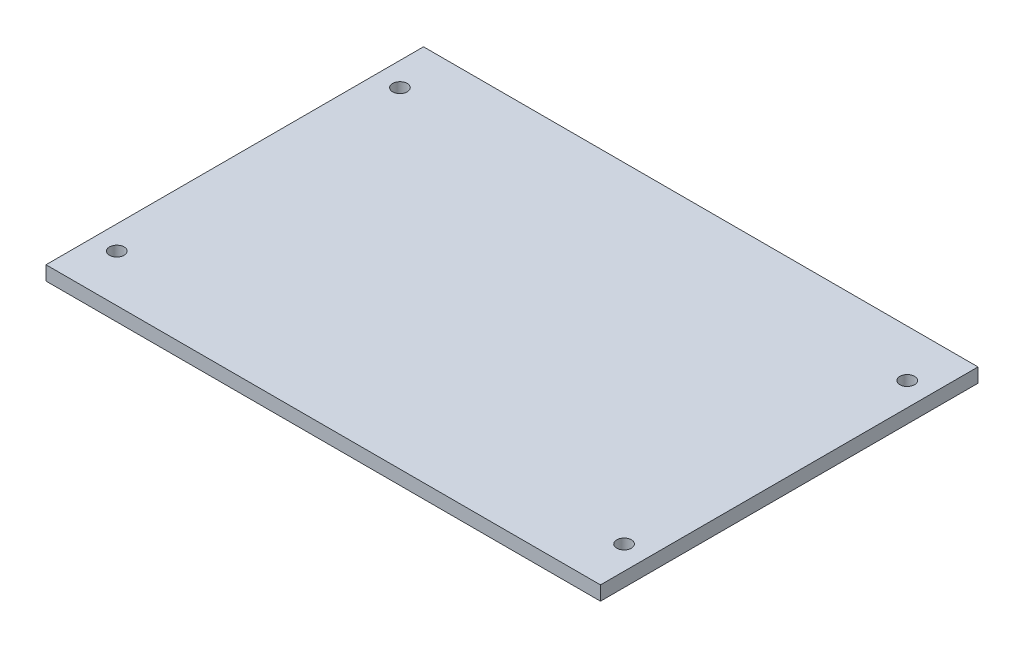
ISO-10303-21;
HEADER;
FILE_DESCRIPTION(('STEP AP214'),'2;1');
FILE_NAME('part.step','',(''),(''),'','','');
FILE_SCHEMA(('AUTOMOTIVE_DESIGN { 1 0 10303 214 1 1 1 1 }'));
ENDSEC;
DATA;
#1=APPLICATION_CONTEXT('core data for automotive mechanical design processes');
#2=APPLICATION_PROTOCOL_DEFINITION('international standard','automotive_design',2000,#1);
#3=PRODUCT_CONTEXT('',#1,'mechanical');
#4=PRODUCT('Part','Part','',(#3));
#5=PRODUCT_RELATED_PRODUCT_CATEGORY('part','',(#4));
#6=PRODUCT_DEFINITION_FORMATION('','',#4);
#7=PRODUCT_DEFINITION_CONTEXT('part definition',#1,'design');
#8=PRODUCT_DEFINITION('design','',#6,#7);
#9=PRODUCT_DEFINITION_SHAPE('','',#8);
#10=(LENGTH_UNIT() NAMED_UNIT(*) SI_UNIT(.MILLI.,.METRE.));
#11=(NAMED_UNIT(*) PLANE_ANGLE_UNIT() SI_UNIT($,.RADIAN.));
#12=(NAMED_UNIT(*) SI_UNIT($,.STERADIAN.) SOLID_ANGLE_UNIT());
#13=UNCERTAINTY_MEASURE_WITH_UNIT(LENGTH_MEASURE(1.E-05),#10,'distance_accuracy_value','');
#14=(GEOMETRIC_REPRESENTATION_CONTEXT(3) GLOBAL_UNCERTAINTY_ASSIGNED_CONTEXT((#13)) GLOBAL_UNIT_ASSIGNED_CONTEXT((#10,
#11,#12)) REPRESENTATION_CONTEXT('',''));
#15=CARTESIAN_POINT('',(0.,0.,0.));
#16=DIRECTION('',(0.,0.,1.));
#17=DIRECTION('',(1.,0.,0.));
#18=AXIS2_PLACEMENT_3D('',#15,#16,#17);
#19=CARTESIAN_POINT('',(0.,0.,80.));
#20=DIRECTION('',(1.,0.,0.));
#21=DIRECTION('',(0.,0.,-1.));
#22=AXIS2_PLACEMENT_3D('',#19,#20,#21);
#23=PLANE('',#22);
#24=DIRECTION('',(0.,-1.,0.));
#25=VECTOR('',#24,1.);
#26=CARTESIAN_POINT('',(0.,0.,0.));
#27=LINE('',#26,#25);
#28=CARTESIAN_POINT('',(0.,3.,0.));
#29=VERTEX_POINT('',#28);
#30=CARTESIAN_POINT('',(0.,0.,0.));
#31=VERTEX_POINT('',#30);
#32=EDGE_CURVE('E117',#29,#31,#27,.T.);
#33=ORIENTED_EDGE('',*,*,#32,.T.);
#34=DIRECTION('',(0.,0.,-1.));
#35=VECTOR('',#34,1.);
#36=CARTESIAN_POINT('',(0.,0.,80.));
#37=LINE('',#36,#35);
#38=CARTESIAN_POINT('',(0.,0.,80.));
#39=VERTEX_POINT('',#38);
#40=EDGE_CURVE('E12',#39,#31,#37,.T.);
#41=ORIENTED_EDGE('',*,*,#40,.F.);
#42=DIRECTION('',(0.,-1.,0.));
#43=VECTOR('',#42,1.);
#44=CARTESIAN_POINT('',(0.,0.,80.));
#45=LINE('',#44,#43);
#46=CARTESIAN_POINT('',(0.,3.,80.));
#47=VERTEX_POINT('',#46);
#48=EDGE_CURVE('E100',#47,#39,#45,.T.);
#49=ORIENTED_EDGE('',*,*,#48,.F.);
#50=DIRECTION('',(0.,0.,-1.));
#51=VECTOR('',#50,1.);
#52=CARTESIAN_POINT('',(0.,3.,80.));
#53=LINE('',#52,#51);
#54=EDGE_CURVE('E112',#47,#29,#53,.T.);
#55=ORIENTED_EDGE('',*,*,#54,.T.);
#56=EDGE_LOOP('',(#33,#41,#49,#55));
#57=FACE_BOUND('',#56,.T.);
#58=ADVANCED_FACE('F48',(#57),#23,.F.);
#59=CARTESIAN_POINT('',(0.,0.,80.));
#60=DIRECTION('',(0.,1.,0.));
#61=DIRECTION('',(0.,0.,1.));
#62=AXIS2_PLACEMENT_3D('',#59,#60,#61);
#63=PLANE('',#62);
#64=CARTESIAN_POINT('',(112.5,0.,9.99999999999998));
#65=DIRECTION('',(0.,1.,0.));
#66=DIRECTION('',(0.,0.,1.));
#67=AXIS2_PLACEMENT_3D('',#64,#65,#66);
#68=CIRCLE('',#67,1.54999999999999);
#69=CARTESIAN_POINT('',(112.5,0.,11.55));
#70=VERTEX_POINT('',#69);
#71=EDGE_CURVE('E175',#70,#70,#68,.F.);
#72=ORIENTED_EDGE('',*,*,#71,.F.);
#73=EDGE_LOOP('',(#72));
#74=FACE_BOUND('',#73,.T.);
#75=CARTESIAN_POINT('',(112.5,0.,70.));
#76=DIRECTION('',(0.,1.,0.));
#77=DIRECTION('',(0.,0.,1.));
#78=AXIS2_PLACEMENT_3D('',#75,#76,#77);
#79=CIRCLE('',#78,1.54999999999999);
#80=CARTESIAN_POINT('',(112.5,0.,71.55));
#81=VERTEX_POINT('',#80);
#82=EDGE_CURVE('E168',#81,#81,#79,.F.);
#83=ORIENTED_EDGE('',*,*,#82,.F.);
#84=EDGE_LOOP('',(#83));
#85=FACE_BOUND('',#84,.T.);
#86=CARTESIAN_POINT('',(5.00000000000001,0.,70.));
#87=DIRECTION('',(0.,1.,0.));
#88=DIRECTION('',(0.,0.,1.));
#89=AXIS2_PLACEMENT_3D('',#86,#87,#88);
#90=CIRCLE('',#89,1.55);
#91=CARTESIAN_POINT('',(5.00000000000001,0.,71.55));
#92=VERTEX_POINT('',#91);
#93=EDGE_CURVE('E167',#92,#92,#90,.F.);
#94=ORIENTED_EDGE('',*,*,#93,.F.);
#95=EDGE_LOOP('',(#94));
#96=FACE_BOUND('',#95,.T.);
#97=CARTESIAN_POINT('',(5.,0.,10.));
#98=DIRECTION('',(0.,1.,0.));
#99=DIRECTION('',(0.,0.,1.));
#100=AXIS2_PLACEMENT_3D('',#97,#98,#99);
#101=CIRCLE('',#100,1.55);
#102=CARTESIAN_POINT('',(5.,0.,11.55));
#103=VERTEX_POINT('',#102);
#104=EDGE_CURVE('E140',#103,#103,#101,.F.);
#105=ORIENTED_EDGE('',*,*,#104,.F.);
#106=EDGE_LOOP('',(#105));
#107=FACE_BOUND('',#106,.T.);
#108=DIRECTION('',(1.,0.,0.));
#109=VECTOR('',#108,1.);
#110=CARTESIAN_POINT('',(0.,0.,0.));
#111=LINE('',#110,#109);
#112=CARTESIAN_POINT('',(117.5,0.,0.));
#113=VERTEX_POINT('',#112);
#114=EDGE_CURVE('E105',#31,#113,#111,.T.);
#115=ORIENTED_EDGE('',*,*,#114,.T.);
#116=DIRECTION('',(0.,0.,-1.));
#117=VECTOR('',#116,1.);
#118=CARTESIAN_POINT('',(117.5,0.,80.));
#119=LINE('',#118,#117);
#120=CARTESIAN_POINT('',(117.5,0.,80.));
#121=VERTEX_POINT('',#120);
#122=EDGE_CURVE('E57',#121,#113,#119,.T.);
#123=ORIENTED_EDGE('',*,*,#122,.F.);
#124=DIRECTION('',(1.,0.,0.));
#125=VECTOR('',#124,1.);
#126=CARTESIAN_POINT('',(0.,0.,80.));
#127=LINE('',#126,#125);
#128=EDGE_CURVE('E95',#39,#121,#127,.T.);
#129=ORIENTED_EDGE('',*,*,#128,.F.);
#130=ORIENTED_EDGE('',*,*,#40,.T.);
#131=EDGE_LOOP('',(#115,#123,#129,#130));
#132=FACE_BOUND('',#131,.T.);
#133=ADVANCED_FACE('F104',(#74,#85,#96,#107,#132),#63,.F.);
#134=CARTESIAN_POINT('',(117.5,0.,80.));
#135=DIRECTION('',(-1.,0.,0.));
#136=DIRECTION('',(0.,0.,1.));
#137=AXIS2_PLACEMENT_3D('',#134,#135,#136);
#138=PLANE('',#137);
#139=DIRECTION('',(0.,1.,0.));
#140=VECTOR('',#139,1.);
#141=CARTESIAN_POINT('',(117.5,0.,0.));
#142=LINE('',#141,#140);
#143=CARTESIAN_POINT('',(117.5,3.,0.));
#144=VERTEX_POINT('',#143);
#145=EDGE_CURVE('E82',#113,#144,#142,.T.);
#146=ORIENTED_EDGE('',*,*,#145,.T.);
#147=DIRECTION('',(0.,0.,-1.));
#148=VECTOR('',#147,1.);
#149=CARTESIAN_POINT('',(117.5,3.,80.));
#150=LINE('',#149,#148);
#151=CARTESIAN_POINT('',(117.5,3.,80.));
#152=VERTEX_POINT('',#151);
#153=EDGE_CURVE('E107',#152,#144,#150,.T.);
#154=ORIENTED_EDGE('',*,*,#153,.F.);
#155=DIRECTION('',(0.,1.,0.));
#156=VECTOR('',#155,1.);
#157=CARTESIAN_POINT('',(117.5,0.,80.));
#158=LINE('',#157,#156);
#159=EDGE_CURVE('E98',#121,#152,#158,.T.);
#160=ORIENTED_EDGE('',*,*,#159,.F.);
#161=ORIENTED_EDGE('',*,*,#122,.T.);
#162=EDGE_LOOP('',(#146,#154,#160,#161));
#163=FACE_BOUND('',#162,.T.);
#164=ADVANCED_FACE('F108',(#163),#138,.F.);
#165=CARTESIAN_POINT('',(0.,3.,80.));
#166=DIRECTION('',(0.,-1.,0.));
#167=DIRECTION('',(0.,0.,-1.));
#168=AXIS2_PLACEMENT_3D('',#165,#166,#167);
#169=PLANE('',#168);
#170=CARTESIAN_POINT('',(112.5,3.,9.99999999999998));
#171=DIRECTION('',(0.,1.,0.));
#172=DIRECTION('',(0.,0.,-1.));
#173=AXIS2_PLACEMENT_3D('',#170,#171,#172);
#174=CIRCLE('',#173,1.54999999999999);
#175=CARTESIAN_POINT('',(112.5,3.,11.55));
#176=VERTEX_POINT('',#175);
#177=EDGE_CURVE('E154',#176,#176,#174,.T.);
#178=ORIENTED_EDGE('',*,*,#177,.F.);
#179=EDGE_LOOP('',(#178));
#180=FACE_BOUND('',#179,.T.);
#181=CARTESIAN_POINT('',(112.5,3.,70.));
#182=DIRECTION('',(0.,1.,0.));
#183=DIRECTION('',(0.,0.,1.));
#184=AXIS2_PLACEMENT_3D('',#181,#182,#183);
#185=CIRCLE('',#184,1.54999999999999);
#186=CARTESIAN_POINT('',(112.5,3.,71.55));
#187=VERTEX_POINT('',#186);
#188=EDGE_CURVE('E171',#187,#187,#185,.T.);
#189=ORIENTED_EDGE('',*,*,#188,.F.);
#190=EDGE_LOOP('',(#189));
#191=FACE_BOUND('',#190,.T.);
#192=CARTESIAN_POINT('',(5.00000000000001,3.,70.));
#193=DIRECTION('',(0.,1.,0.));
#194=DIRECTION('',(0.,0.,-1.));
#195=AXIS2_PLACEMENT_3D('',#192,#193,#194);
#196=CIRCLE('',#195,1.55);
#197=CARTESIAN_POINT('',(5.00000000000001,3.,71.55));
#198=VERTEX_POINT('',#197);
#199=EDGE_CURVE('E150',#198,#198,#196,.T.);
#200=ORIENTED_EDGE('',*,*,#199,.F.);
#201=EDGE_LOOP('',(#200));
#202=FACE_BOUND('',#201,.T.);
#203=CARTESIAN_POINT('',(5.,3.,10.));
#204=DIRECTION('',(0.,1.,0.));
#205=DIRECTION('',(0.,0.,1.));
#206=AXIS2_PLACEMENT_3D('',#203,#204,#205);
#207=CIRCLE('',#206,1.55);
#208=CARTESIAN_POINT('',(5.,3.,11.55));
#209=VERTEX_POINT('',#208);
#210=EDGE_CURVE('E144',#209,#209,#207,.T.);
#211=ORIENTED_EDGE('',*,*,#210,.F.);
#212=EDGE_LOOP('',(#211));
#213=FACE_BOUND('',#212,.T.);
#214=DIRECTION('',(-1.,0.,0.));
#215=VECTOR('',#214,1.);
#216=CARTESIAN_POINT('',(0.,3.,0.));
#217=LINE('',#216,#215);
#218=EDGE_CURVE('E88',#144,#29,#217,.T.);
#219=ORIENTED_EDGE('',*,*,#218,.T.);
#220=ORIENTED_EDGE('',*,*,#54,.F.);
#221=DIRECTION('',(-1.,0.,0.));
#222=VECTOR('',#221,1.);
#223=CARTESIAN_POINT('',(0.,3.,80.));
#224=LINE('',#223,#222);
#225=EDGE_CURVE('E65',#152,#47,#224,.T.);
#226=ORIENTED_EDGE('',*,*,#225,.F.);
#227=ORIENTED_EDGE('',*,*,#153,.T.);
#228=EDGE_LOOP('',(#219,#220,#226,#227));
#229=FACE_BOUND('',#228,.T.);
#230=ADVANCED_FACE('F130',(#180,#191,#202,#213,#229),#169,.F.);
#231=CARTESIAN_POINT('',(0.,0.,80.));
#232=DIRECTION('',(0.,0.,-1.));
#233=DIRECTION('',(-1.,0.,0.));
#234=AXIS2_PLACEMENT_3D('',#231,#232,#233);
#235=PLANE('',#234);
#236=ORIENTED_EDGE('',*,*,#48,.T.);
#237=ORIENTED_EDGE('',*,*,#128,.T.);
#238=ORIENTED_EDGE('',*,*,#159,.T.);
#239=ORIENTED_EDGE('',*,*,#225,.T.);
#240=EDGE_LOOP('',(#236,#237,#238,#239));
#241=FACE_BOUND('',#240,.T.);
#242=ADVANCED_FACE('F96',(#241),#235,.F.);
#243=CARTESIAN_POINT('',(0.,0.,0.));
#244=DIRECTION('',(0.,0.,-1.));
#245=DIRECTION('',(-1.,0.,0.));
#246=AXIS2_PLACEMENT_3D('',#243,#244,#245);
#247=PLANE('',#246);
#248=ORIENTED_EDGE('',*,*,#32,.F.);
#249=ORIENTED_EDGE('',*,*,#218,.F.);
#250=ORIENTED_EDGE('',*,*,#145,.F.);
#251=ORIENTED_EDGE('',*,*,#114,.F.);
#252=EDGE_LOOP('',(#248,#249,#250,#251));
#253=FACE_BOUND('',#252,.T.);
#254=ADVANCED_FACE('F133',(#253),#247,.T.);
#255=CARTESIAN_POINT('',(5.,-0.00100000000000013,10.));
#256=DIRECTION('',(0.,1.,0.));
#257=DIRECTION('',(0.,0.,1.));
#258=AXIS2_PLACEMENT_3D('',#255,#256,#257);
#259=CYLINDRICAL_SURFACE('',#258,1.55);
#260=CARTESIAN_POINT('',(5.,3.,11.55));
#261=CARTESIAN_POINT('',(5.,2.96875,11.55));
#262=CARTESIAN_POINT('',(5.,2.9375,11.55));
#263=CARTESIAN_POINT('',(5.,2.875,11.55));
#264=CARTESIAN_POINT('',(5.,2.84375,11.55));
#265=CARTESIAN_POINT('',(5.,2.78125,11.55));
#266=CARTESIAN_POINT('',(5.,2.75,11.55));
#267=CARTESIAN_POINT('',(5.,2.6875,11.55));
#268=CARTESIAN_POINT('',(5.,2.65625,11.55));
#269=CARTESIAN_POINT('',(5.,2.59375,11.55));
#270=CARTESIAN_POINT('',(5.,2.5625,11.55));
#271=CARTESIAN_POINT('',(5.,2.5,11.55));
#272=CARTESIAN_POINT('',(5.,2.46875,11.55));
#273=CARTESIAN_POINT('',(5.,2.40625,11.55));
#274=CARTESIAN_POINT('',(5.,2.375,11.55));
#275=CARTESIAN_POINT('',(5.,2.3125,11.55));
#276=CARTESIAN_POINT('',(5.,2.28125,11.55));
#277=CARTESIAN_POINT('',(5.,2.21875,11.55));
#278=CARTESIAN_POINT('',(5.,2.1875,11.55));
#279=CARTESIAN_POINT('',(5.,2.125,11.55));
#280=CARTESIAN_POINT('',(5.,2.09375,11.55));
#281=CARTESIAN_POINT('',(5.,2.03125,11.55));
#282=CARTESIAN_POINT('',(5.,2.,11.55));
#283=CARTESIAN_POINT('',(5.,1.9375,11.55));
#284=CARTESIAN_POINT('',(5.,1.90625,11.55));
#285=CARTESIAN_POINT('',(5.,1.84375,11.55));
#286=CARTESIAN_POINT('',(5.,1.8125,11.55));
#287=CARTESIAN_POINT('',(5.,1.75,11.55));
#288=CARTESIAN_POINT('',(5.,1.71875,11.55));
#289=CARTESIAN_POINT('',(5.,1.65625,11.55));
#290=CARTESIAN_POINT('',(5.,1.625,11.55));
#291=CARTESIAN_POINT('',(5.,1.5625,11.55));
#292=CARTESIAN_POINT('',(5.,1.53125,11.55));
#293=CARTESIAN_POINT('',(5.,1.46875,11.55));
#294=CARTESIAN_POINT('',(5.,1.4375,11.55));
#295=CARTESIAN_POINT('',(5.,1.375,11.55));
#296=CARTESIAN_POINT('',(5.,1.34375,11.55));
#297=CARTESIAN_POINT('',(5.,1.28125,11.55));
#298=CARTESIAN_POINT('',(5.,1.25,11.55));
#299=CARTESIAN_POINT('',(5.,1.1875,11.55));
#300=CARTESIAN_POINT('',(5.,1.15625,11.55));
#301=CARTESIAN_POINT('',(5.,1.09375,11.55));
#302=CARTESIAN_POINT('',(5.,1.0625,11.55));
#303=CARTESIAN_POINT('',(5.,1.,11.55));
#304=CARTESIAN_POINT('',(5.,0.96875,11.55));
#305=CARTESIAN_POINT('',(5.,0.90625,11.55));
#306=CARTESIAN_POINT('',(5.,0.875,11.55));
#307=CARTESIAN_POINT('',(5.,0.8125,11.55));
#308=CARTESIAN_POINT('',(5.,0.78125,11.55));
#309=CARTESIAN_POINT('',(5.,0.71875,11.55));
#310=CARTESIAN_POINT('',(5.,0.6875,11.55));
#311=CARTESIAN_POINT('',(5.,0.625,11.55));
#312=CARTESIAN_POINT('',(5.,0.59375,11.55));
#313=CARTESIAN_POINT('',(5.,0.53125,11.55));
#314=CARTESIAN_POINT('',(5.,0.5,11.55));
#315=CARTESIAN_POINT('',(5.,0.4375,11.55));
#316=CARTESIAN_POINT('',(5.,0.40625,11.55));
#317=CARTESIAN_POINT('',(5.,0.34375,11.55));
#318=CARTESIAN_POINT('',(5.,0.3125,11.55));
#319=CARTESIAN_POINT('',(5.,0.25,11.55));
#320=CARTESIAN_POINT('',(5.,0.21875,11.55));
#321=CARTESIAN_POINT('',(5.,0.15625,11.55));
#322=CARTESIAN_POINT('',(5.,0.125,11.55));
#323=CARTESIAN_POINT('',(5.,0.0625000000000001,11.55));
#324=CARTESIAN_POINT('',(5.,0.0312500000000001,11.55));
#325=CARTESIAN_POINT('',(5.,0.,11.55));
#326=B_SPLINE_CURVE_WITH_KNOTS('',3,(#260,#261,#262,#263,#264,#265,#266,#267,#268,#269,#270,
#271,#272,#273,#274,#275,#276,#277,#278,#279,#280,#281,#282,#283,#284,#285,#286,#287,#288,#289,
#290,#291,#292,#293,#294,#295,#296,#297,#298,#299,#300,#301,#302,#303,#304,#305,#306,#307,#308,
#309,#310,#311,#312,#313,#314,#315,#316,#317,#318,#319,#320,#321,#322,#323,#324,#325),
.UNSPECIFIED.,.F.,.F.,(4,2,2,2,2,2,2,2,2,2,2,2,2,2,2,2,2,2,2,2,2,2,2,2,2,2,2,2,2,2,2,2,4),(0.,
0.0937500000000001,0.1875,0.28125,0.375,0.46875,0.5625,0.65625,0.75,0.84375,0.9375,1.03125,
1.125,1.21875,1.3125,1.40625,1.5,1.59375,1.6875,1.78125,1.875,1.96875,2.0625,2.15625,2.25,
2.34375,2.4375,2.53125,2.625,2.71875,2.8125,2.90625,3.),.UNSPECIFIED.);
#327=EDGE_CURVE('BSEAM195',#209,#103,#326,.T.);
#328=ORIENTED_EDGE('',*,*,#210,.T.);
#329=ORIENTED_EDGE('',*,*,#104,.T.);
#330=ORIENTED_EDGE('',*,*,#327,.T.);
#331=ORIENTED_EDGE('',*,*,#327,.F.);
#332=EDGE_LOOP('',(#328,#330,#329,#331));
#333=FACE_BOUND('',#332,.T.);
#334=ADVANCED_FACE('F195',(#333),#259,.F.);
#335=CARTESIAN_POINT('',(5.00000000000001,-0.00100000000000013,70.));
#336=DIRECTION('',(0.,1.,0.));
#337=DIRECTION('',(0.,0.,1.));
#338=AXIS2_PLACEMENT_3D('',#335,#336,#337);
#339=CYLINDRICAL_SURFACE('',#338,1.55);
#340=CARTESIAN_POINT('',(5.00000000000001,3.,71.55));
#341=CARTESIAN_POINT('',(5.00000000000001,2.96875,71.55));
#342=CARTESIAN_POINT('',(5.00000000000001,2.9375,71.55));
#343=CARTESIAN_POINT('',(5.00000000000001,2.875,71.55));
#344=CARTESIAN_POINT('',(5.00000000000001,2.84375,71.55));
#345=CARTESIAN_POINT('',(5.00000000000001,2.78125,71.55));
#346=CARTESIAN_POINT('',(5.00000000000001,2.75,71.55));
#347=CARTESIAN_POINT('',(5.00000000000001,2.6875,71.55));
#348=CARTESIAN_POINT('',(5.00000000000001,2.65625,71.55));
#349=CARTESIAN_POINT('',(5.00000000000001,2.59375,71.55));
#350=CARTESIAN_POINT('',(5.00000000000001,2.5625,71.55));
#351=CARTESIAN_POINT('',(5.00000000000001,2.5,71.55));
#352=CARTESIAN_POINT('',(5.00000000000001,2.46875,71.55));
#353=CARTESIAN_POINT('',(5.00000000000001,2.40625,71.55));
#354=CARTESIAN_POINT('',(5.00000000000001,2.375,71.55));
#355=CARTESIAN_POINT('',(5.00000000000001,2.3125,71.55));
#356=CARTESIAN_POINT('',(5.00000000000001,2.28125,71.55));
#357=CARTESIAN_POINT('',(5.00000000000001,2.21875,71.55));
#358=CARTESIAN_POINT('',(5.00000000000001,2.1875,71.55));
#359=CARTESIAN_POINT('',(5.00000000000001,2.125,71.55));
#360=CARTESIAN_POINT('',(5.00000000000001,2.09375,71.55));
#361=CARTESIAN_POINT('',(5.00000000000001,2.03125,71.55));
#362=CARTESIAN_POINT('',(5.00000000000001,2.,71.55));
#363=CARTESIAN_POINT('',(5.00000000000001,1.9375,71.55));
#364=CARTESIAN_POINT('',(5.00000000000001,1.90625,71.55));
#365=CARTESIAN_POINT('',(5.00000000000001,1.84375,71.55));
#366=CARTESIAN_POINT('',(5.00000000000001,1.8125,71.55));
#367=CARTESIAN_POINT('',(5.00000000000001,1.75,71.55));
#368=CARTESIAN_POINT('',(5.00000000000001,1.71875,71.55));
#369=CARTESIAN_POINT('',(5.00000000000001,1.65625,71.55));
#370=CARTESIAN_POINT('',(5.00000000000001,1.625,71.55));
#371=CARTESIAN_POINT('',(5.00000000000001,1.5625,71.55));
#372=CARTESIAN_POINT('',(5.00000000000001,1.53125,71.55));
#373=CARTESIAN_POINT('',(5.00000000000001,1.46875,71.55));
#374=CARTESIAN_POINT('',(5.00000000000001,1.4375,71.55));
#375=CARTESIAN_POINT('',(5.00000000000001,1.375,71.55));
#376=CARTESIAN_POINT('',(5.00000000000001,1.34375,71.55));
#377=CARTESIAN_POINT('',(5.00000000000001,1.28125,71.55));
#378=CARTESIAN_POINT('',(5.00000000000001,1.25,71.55));
#379=CARTESIAN_POINT('',(5.00000000000001,1.1875,71.55));
#380=CARTESIAN_POINT('',(5.00000000000001,1.15625,71.55));
#381=CARTESIAN_POINT('',(5.00000000000001,1.09375,71.55));
#382=CARTESIAN_POINT('',(5.00000000000001,1.0625,71.55));
#383=CARTESIAN_POINT('',(5.00000000000001,1.,71.55));
#384=CARTESIAN_POINT('',(5.00000000000001,0.96875,71.55));
#385=CARTESIAN_POINT('',(5.00000000000001,0.90625,71.55));
#386=CARTESIAN_POINT('',(5.00000000000001,0.875,71.55));
#387=CARTESIAN_POINT('',(5.00000000000001,0.8125,71.55));
#388=CARTESIAN_POINT('',(5.00000000000001,0.78125,71.55));
#389=CARTESIAN_POINT('',(5.00000000000001,0.71875,71.55));
#390=CARTESIAN_POINT('',(5.00000000000001,0.6875,71.55));
#391=CARTESIAN_POINT('',(5.00000000000001,0.625,71.55));
#392=CARTESIAN_POINT('',(5.00000000000001,0.59375,71.55));
#393=CARTESIAN_POINT('',(5.00000000000001,0.53125,71.55));
#394=CARTESIAN_POINT('',(5.00000000000001,0.5,71.55));
#395=CARTESIAN_POINT('',(5.00000000000001,0.4375,71.55));
#396=CARTESIAN_POINT('',(5.00000000000001,0.40625,71.55));
#397=CARTESIAN_POINT('',(5.00000000000001,0.34375,71.55));
#398=CARTESIAN_POINT('',(5.00000000000001,0.3125,71.55));
#399=CARTESIAN_POINT('',(5.00000000000001,0.25,71.55));
#400=CARTESIAN_POINT('',(5.00000000000001,0.21875,71.55));
#401=CARTESIAN_POINT('',(5.00000000000001,0.15625,71.55));
#402=CARTESIAN_POINT('',(5.00000000000001,0.125,71.55));
#403=CARTESIAN_POINT('',(5.00000000000001,0.0625000000000001,71.55));
#404=CARTESIAN_POINT('',(5.00000000000001,0.0312500000000001,71.55));
#405=CARTESIAN_POINT('',(5.00000000000001,0.,71.55));
#406=B_SPLINE_CURVE_WITH_KNOTS('',3,(#340,#341,#342,#343,#344,#345,#346,#347,#348,#349,#350,
#351,#352,#353,#354,#355,#356,#357,#358,#359,#360,#361,#362,#363,#364,#365,#366,#367,#368,#369,
#370,#371,#372,#373,#374,#375,#376,#377,#378,#379,#380,#381,#382,#383,#384,#385,#386,#387,#388,
#389,#390,#391,#392,#393,#394,#395,#396,#397,#398,#399,#400,#401,#402,#403,#404,#405),
.UNSPECIFIED.,.F.,.F.,(4,2,2,2,2,2,2,2,2,2,2,2,2,2,2,2,2,2,2,2,2,2,2,2,2,2,2,2,2,2,2,2,4),(0.,
0.0937500000000001,0.1875,0.28125,0.375,0.46875,0.5625,0.65625,0.75,0.84375,0.9375,1.03125,
1.125,1.21875,1.3125,1.40625,1.5,1.59375,1.6875,1.78125,1.875,1.96875,2.0625,2.15625,2.25,
2.34375,2.4375,2.53125,2.625,2.71875,2.8125,2.90625,3.),.UNSPECIFIED.);
#407=EDGE_CURVE('BSEAM197',#198,#92,#406,.T.);
#408=ORIENTED_EDGE('',*,*,#199,.T.);
#409=ORIENTED_EDGE('',*,*,#93,.T.);
#410=ORIENTED_EDGE('',*,*,#407,.T.);
#411=ORIENTED_EDGE('',*,*,#407,.F.);
#412=EDGE_LOOP('',(#408,#410,#409,#411));
#413=FACE_BOUND('',#412,.T.);
#414=ADVANCED_FACE('F197',(#413),#339,.F.);
#415=CARTESIAN_POINT('',(112.5,-0.00100000000000013,70.));
#416=DIRECTION('',(0.,1.,0.));
#417=DIRECTION('',(0.,0.,1.));
#418=AXIS2_PLACEMENT_3D('',#415,#416,#417);
#419=CYLINDRICAL_SURFACE('',#418,1.54999999999999);
#420=CARTESIAN_POINT('',(112.5,3.,71.55));
#421=CARTESIAN_POINT('',(112.5,2.96875,71.55));
#422=CARTESIAN_POINT('',(112.5,2.9375,71.55));
#423=CARTESIAN_POINT('',(112.5,2.875,71.55));
#424=CARTESIAN_POINT('',(112.5,2.84375,71.55));
#425=CARTESIAN_POINT('',(112.5,2.78125,71.55));
#426=CARTESIAN_POINT('',(112.5,2.75,71.55));
#427=CARTESIAN_POINT('',(112.5,2.6875,71.55));
#428=CARTESIAN_POINT('',(112.5,2.65625,71.55));
#429=CARTESIAN_POINT('',(112.5,2.59375,71.55));
#430=CARTESIAN_POINT('',(112.5,2.5625,71.55));
#431=CARTESIAN_POINT('',(112.5,2.5,71.55));
#432=CARTESIAN_POINT('',(112.5,2.46875,71.55));
#433=CARTESIAN_POINT('',(112.5,2.40625,71.55));
#434=CARTESIAN_POINT('',(112.5,2.375,71.55));
#435=CARTESIAN_POINT('',(112.5,2.3125,71.55));
#436=CARTESIAN_POINT('',(112.5,2.28125,71.55));
#437=CARTESIAN_POINT('',(112.5,2.21875,71.55));
#438=CARTESIAN_POINT('',(112.5,2.1875,71.55));
#439=CARTESIAN_POINT('',(112.5,2.125,71.55));
#440=CARTESIAN_POINT('',(112.5,2.09375,71.55));
#441=CARTESIAN_POINT('',(112.5,2.03125,71.55));
#442=CARTESIAN_POINT('',(112.5,2.,71.55));
#443=CARTESIAN_POINT('',(112.5,1.9375,71.55));
#444=CARTESIAN_POINT('',(112.5,1.90625,71.55));
#445=CARTESIAN_POINT('',(112.5,1.84375,71.55));
#446=CARTESIAN_POINT('',(112.5,1.8125,71.55));
#447=CARTESIAN_POINT('',(112.5,1.75,71.55));
#448=CARTESIAN_POINT('',(112.5,1.71875,71.55));
#449=CARTESIAN_POINT('',(112.5,1.65625,71.55));
#450=CARTESIAN_POINT('',(112.5,1.625,71.55));
#451=CARTESIAN_POINT('',(112.5,1.5625,71.55));
#452=CARTESIAN_POINT('',(112.5,1.53125,71.55));
#453=CARTESIAN_POINT('',(112.5,1.46875,71.55));
#454=CARTESIAN_POINT('',(112.5,1.4375,71.55));
#455=CARTESIAN_POINT('',(112.5,1.375,71.55));
#456=CARTESIAN_POINT('',(112.5,1.34375,71.55));
#457=CARTESIAN_POINT('',(112.5,1.28125,71.55));
#458=CARTESIAN_POINT('',(112.5,1.25,71.55));
#459=CARTESIAN_POINT('',(112.5,1.1875,71.55));
#460=CARTESIAN_POINT('',(112.5,1.15625,71.55));
#461=CARTESIAN_POINT('',(112.5,1.09375,71.55));
#462=CARTESIAN_POINT('',(112.5,1.0625,71.55));
#463=CARTESIAN_POINT('',(112.5,1.,71.55));
#464=CARTESIAN_POINT('',(112.5,0.96875,71.55));
#465=CARTESIAN_POINT('',(112.5,0.90625,71.55));
#466=CARTESIAN_POINT('',(112.5,0.875,71.55));
#467=CARTESIAN_POINT('',(112.5,0.8125,71.55));
#468=CARTESIAN_POINT('',(112.5,0.78125,71.55));
#469=CARTESIAN_POINT('',(112.5,0.71875,71.55));
#470=CARTESIAN_POINT('',(112.5,0.6875,71.55));
#471=CARTESIAN_POINT('',(112.5,0.625,71.55));
#472=CARTESIAN_POINT('',(112.5,0.59375,71.55));
#473=CARTESIAN_POINT('',(112.5,0.53125,71.55));
#474=CARTESIAN_POINT('',(112.5,0.5,71.55));
#475=CARTESIAN_POINT('',(112.5,0.4375,71.55));
#476=CARTESIAN_POINT('',(112.5,0.40625,71.55));
#477=CARTESIAN_POINT('',(112.5,0.34375,71.55));
#478=CARTESIAN_POINT('',(112.5,0.3125,71.55));
#479=CARTESIAN_POINT('',(112.5,0.25,71.55));
#480=CARTESIAN_POINT('',(112.5,0.21875,71.55));
#481=CARTESIAN_POINT('',(112.5,0.15625,71.55));
#482=CARTESIAN_POINT('',(112.5,0.125,71.55));
#483=CARTESIAN_POINT('',(112.5,0.0625000000000001,71.55));
#484=CARTESIAN_POINT('',(112.5,0.0312500000000001,71.55));
#485=CARTESIAN_POINT('',(112.5,0.,71.55));
#486=B_SPLINE_CURVE_WITH_KNOTS('',3,(#420,#421,#422,#423,#424,#425,#426,#427,#428,#429,#430,
#431,#432,#433,#434,#435,#436,#437,#438,#439,#440,#441,#442,#443,#444,#445,#446,#447,#448,#449,
#450,#451,#452,#453,#454,#455,#456,#457,#458,#459,#460,#461,#462,#463,#464,#465,#466,#467,#468,
#469,#470,#471,#472,#473,#474,#475,#476,#477,#478,#479,#480,#481,#482,#483,#484,#485),
.UNSPECIFIED.,.F.,.F.,(4,2,2,2,2,2,2,2,2,2,2,2,2,2,2,2,2,2,2,2,2,2,2,2,2,2,2,2,2,2,2,2,4),(0.,
0.0937500000000001,0.1875,0.28125,0.375,0.46875,0.5625,0.65625,0.75,0.84375,0.9375,1.03125,
1.125,1.21875,1.3125,1.40625,1.5,1.59375,1.6875,1.78125,1.875,1.96875,2.0625,2.15625,2.25,
2.34375,2.4375,2.53125,2.625,2.71875,2.8125,2.90625,3.),.UNSPECIFIED.);
#487=EDGE_CURVE('BSEAM203',#187,#81,#486,.T.);
#488=ORIENTED_EDGE('',*,*,#188,.T.);
#489=ORIENTED_EDGE('',*,*,#82,.T.);
#490=ORIENTED_EDGE('',*,*,#487,.T.);
#491=ORIENTED_EDGE('',*,*,#487,.F.);
#492=EDGE_LOOP('',(#488,#490,#489,#491));
#493=FACE_BOUND('',#492,.T.);
#494=ADVANCED_FACE('F203',(#493),#419,.F.);
#495=CARTESIAN_POINT('',(112.5,-0.00100000000000013,9.99999999999998));
#496=DIRECTION('',(0.,1.,0.));
#497=DIRECTION('',(0.,0.,1.));
#498=AXIS2_PLACEMENT_3D('',#495,#496,#497);
#499=CYLINDRICAL_SURFACE('',#498,1.54999999999999);
#500=CARTESIAN_POINT('',(112.5,3.,11.55));
#501=CARTESIAN_POINT('',(112.5,2.96875,11.55));
#502=CARTESIAN_POINT('',(112.5,2.9375,11.55));
#503=CARTESIAN_POINT('',(112.5,2.875,11.55));
#504=CARTESIAN_POINT('',(112.5,2.84375,11.55));
#505=CARTESIAN_POINT('',(112.5,2.78125,11.55));
#506=CARTESIAN_POINT('',(112.5,2.75,11.55));
#507=CARTESIAN_POINT('',(112.5,2.6875,11.55));
#508=CARTESIAN_POINT('',(112.5,2.65625,11.55));
#509=CARTESIAN_POINT('',(112.5,2.59375,11.55));
#510=CARTESIAN_POINT('',(112.5,2.5625,11.55));
#511=CARTESIAN_POINT('',(112.5,2.5,11.55));
#512=CARTESIAN_POINT('',(112.5,2.46875,11.55));
#513=CARTESIAN_POINT('',(112.5,2.40625,11.55));
#514=CARTESIAN_POINT('',(112.5,2.375,11.55));
#515=CARTESIAN_POINT('',(112.5,2.3125,11.55));
#516=CARTESIAN_POINT('',(112.5,2.28125,11.55));
#517=CARTESIAN_POINT('',(112.5,2.21875,11.55));
#518=CARTESIAN_POINT('',(112.5,2.1875,11.55));
#519=CARTESIAN_POINT('',(112.5,2.125,11.55));
#520=CARTESIAN_POINT('',(112.5,2.09375,11.55));
#521=CARTESIAN_POINT('',(112.5,2.03125,11.55));
#522=CARTESIAN_POINT('',(112.5,2.,11.55));
#523=CARTESIAN_POINT('',(112.5,1.9375,11.55));
#524=CARTESIAN_POINT('',(112.5,1.90625,11.55));
#525=CARTESIAN_POINT('',(112.5,1.84375,11.55));
#526=CARTESIAN_POINT('',(112.5,1.8125,11.55));
#527=CARTESIAN_POINT('',(112.5,1.75,11.55));
#528=CARTESIAN_POINT('',(112.5,1.71875,11.55));
#529=CARTESIAN_POINT('',(112.5,1.65625,11.55));
#530=CARTESIAN_POINT('',(112.5,1.625,11.55));
#531=CARTESIAN_POINT('',(112.5,1.5625,11.55));
#532=CARTESIAN_POINT('',(112.5,1.53125,11.55));
#533=CARTESIAN_POINT('',(112.5,1.46875,11.55));
#534=CARTESIAN_POINT('',(112.5,1.4375,11.55));
#535=CARTESIAN_POINT('',(112.5,1.375,11.55));
#536=CARTESIAN_POINT('',(112.5,1.34375,11.55));
#537=CARTESIAN_POINT('',(112.5,1.28125,11.55));
#538=CARTESIAN_POINT('',(112.5,1.25,11.55));
#539=CARTESIAN_POINT('',(112.5,1.1875,11.55));
#540=CARTESIAN_POINT('',(112.5,1.15625,11.55));
#541=CARTESIAN_POINT('',(112.5,1.09375,11.55));
#542=CARTESIAN_POINT('',(112.5,1.0625,11.55));
#543=CARTESIAN_POINT('',(112.5,1.,11.55));
#544=CARTESIAN_POINT('',(112.5,0.96875,11.55));
#545=CARTESIAN_POINT('',(112.5,0.90625,11.55));
#546=CARTESIAN_POINT('',(112.5,0.875,11.55));
#547=CARTESIAN_POINT('',(112.5,0.8125,11.55));
#548=CARTESIAN_POINT('',(112.5,0.78125,11.55));
#549=CARTESIAN_POINT('',(112.5,0.71875,11.55));
#550=CARTESIAN_POINT('',(112.5,0.6875,11.55));
#551=CARTESIAN_POINT('',(112.5,0.625,11.55));
#552=CARTESIAN_POINT('',(112.5,0.59375,11.55));
#553=CARTESIAN_POINT('',(112.5,0.53125,11.55));
#554=CARTESIAN_POINT('',(112.5,0.5,11.55));
#555=CARTESIAN_POINT('',(112.5,0.4375,11.55));
#556=CARTESIAN_POINT('',(112.5,0.40625,11.55));
#557=CARTESIAN_POINT('',(112.5,0.34375,11.55));
#558=CARTESIAN_POINT('',(112.5,0.3125,11.55));
#559=CARTESIAN_POINT('',(112.5,0.25,11.55));
#560=CARTESIAN_POINT('',(112.5,0.21875,11.55));
#561=CARTESIAN_POINT('',(112.5,0.15625,11.55));
#562=CARTESIAN_POINT('',(112.5,0.125,11.55));
#563=CARTESIAN_POINT('',(112.5,0.0625000000000001,11.55));
#564=CARTESIAN_POINT('',(112.5,0.0312500000000001,11.55));
#565=CARTESIAN_POINT('',(112.5,0.,11.55));
#566=B_SPLINE_CURVE_WITH_KNOTS('',3,(#500,#501,#502,#503,#504,#505,#506,#507,#508,#509,#510,
#511,#512,#513,#514,#515,#516,#517,#518,#519,#520,#521,#522,#523,#524,#525,#526,#527,#528,#529,
#530,#531,#532,#533,#534,#535,#536,#537,#538,#539,#540,#541,#542,#543,#544,#545,#546,#547,#548,
#549,#550,#551,#552,#553,#554,#555,#556,#557,#558,#559,#560,#561,#562,#563,#564,#565),
.UNSPECIFIED.,.F.,.F.,(4,2,2,2,2,2,2,2,2,2,2,2,2,2,2,2,2,2,2,2,2,2,2,2,2,2,2,2,2,2,2,2,4),(0.,
0.0937500000000001,0.1875,0.28125,0.375,0.46875,0.5625,0.65625,0.75,0.84375,0.9375,1.03125,
1.125,1.21875,1.3125,1.40625,1.5,1.59375,1.6875,1.78125,1.875,1.96875,2.0625,2.15625,2.25,
2.34375,2.4375,2.53125,2.625,2.71875,2.8125,2.90625,3.),.UNSPECIFIED.);
#567=EDGE_CURVE('BSEAM184',#176,#70,#566,.T.);
#568=ORIENTED_EDGE('',*,*,#177,.T.);
#569=ORIENTED_EDGE('',*,*,#71,.T.);
#570=ORIENTED_EDGE('',*,*,#567,.T.);
#571=ORIENTED_EDGE('',*,*,#567,.F.);
#572=EDGE_LOOP('',(#568,#570,#569,#571));
#573=FACE_BOUND('',#572,.T.);
#574=ADVANCED_FACE('F184',(#573),#499,.F.);
#575=CLOSED_SHELL('',(#58,#133,#164,#230,#242,#254,#334,#414,#494,#574));
#576=MANIFOLD_SOLID_BREP('B2',#575);
#577=ADVANCED_BREP_SHAPE_REPRESENTATION('',(#18,#576),#14);
#578=SHAPE_DEFINITION_REPRESENTATION(#9,#577);
ENDSEC;
END-ISO-10303-21;
